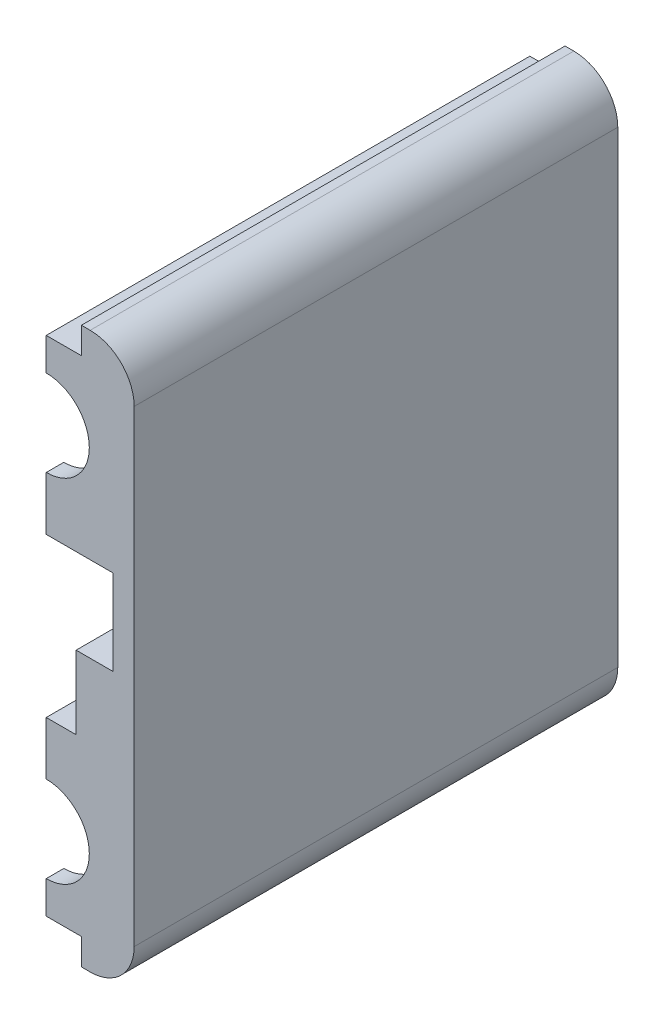
ISO-10303-21;
HEADER;
FILE_DESCRIPTION(('STEP AP214'),'2;1');
FILE_NAME('part.step','',(''),(''),'','','');
FILE_SCHEMA(('AUTOMOTIVE_DESIGN { 1 0 10303 214 1 1 1 1 }'));
ENDSEC;
DATA;
#1=APPLICATION_CONTEXT('core data for automotive mechanical design processes');
#2=APPLICATION_PROTOCOL_DEFINITION('international standard','automotive_design',2000,#1);
#3=PRODUCT_CONTEXT('',#1,'mechanical');
#4=PRODUCT('Part','Part','',(#3));
#5=PRODUCT_RELATED_PRODUCT_CATEGORY('part','',(#4));
#6=PRODUCT_DEFINITION_FORMATION('','',#4);
#7=PRODUCT_DEFINITION_CONTEXT('part definition',#1,'design');
#8=PRODUCT_DEFINITION('design','',#6,#7);
#9=PRODUCT_DEFINITION_SHAPE('','',#8);
#10=(LENGTH_UNIT() NAMED_UNIT(*) SI_UNIT(.MILLI.,.METRE.));
#11=(NAMED_UNIT(*) PLANE_ANGLE_UNIT() SI_UNIT($,.RADIAN.));
#12=(NAMED_UNIT(*) SI_UNIT($,.STERADIAN.) SOLID_ANGLE_UNIT());
#13=UNCERTAINTY_MEASURE_WITH_UNIT(LENGTH_MEASURE(1.E-05),#10,'distance_accuracy_value','');
#14=(GEOMETRIC_REPRESENTATION_CONTEXT(3) GLOBAL_UNCERTAINTY_ASSIGNED_CONTEXT((#13)) GLOBAL_UNIT_ASSIGNED_CONTEXT((#10,
#11,#12)) REPRESENTATION_CONTEXT('',''));
#15=CARTESIAN_POINT('',(0.,0.,0.));
#16=DIRECTION('',(0.,0.,1.));
#17=DIRECTION('',(1.,0.,0.));
#18=AXIS2_PLACEMENT_3D('',#15,#16,#17);
#19=CARTESIAN_POINT('',(-10.,-51.6,55.));
#20=DIRECTION('',(0.,0.,-1.));
#21=DIRECTION('',(-1.,0.,0.));
#22=AXIS2_PLACEMENT_3D('',#19,#20,#21);
#23=CYLINDRICAL_SURFACE('',#22,7.6);
#24=CARTESIAN_POINT('',(-10.,-51.6,53.));
#25=DIRECTION('',(0.,0.,-1.));
#26=DIRECTION('',(1.,0.,0.));
#27=AXIS2_PLACEMENT_3D('',#24,#25,#26);
#28=CIRCLE('',#27,7.6);
#29=CARTESIAN_POINT('',(-10.,-44.,53.));
#30=VERTEX_POINT('',#29);
#31=CARTESIAN_POINT('',(-10.,-59.2,53.));
#32=VERTEX_POINT('',#31);
#33=EDGE_CURVE('E547',#30,#32,#28,.T.);
#34=ORIENTED_EDGE('',*,*,#33,.F.);
#35=DIRECTION('',(0.,0.,-1.));
#36=VECTOR('',#35,1.);
#37=CARTESIAN_POINT('',(-10.,-44.,55.));
#38=LINE('',#37,#36);
#39=CARTESIAN_POINT('',(-10.,-44.,28.5));
#40=VERTEX_POINT('',#39);
#41=EDGE_CURVE('E352',#30,#40,#38,.T.);
#42=ORIENTED_EDGE('',*,*,#41,.T.);
#43=CARTESIAN_POINT('',(-10.,-51.6,28.5));
#44=DIRECTION('',(0.,0.,-1.));
#45=DIRECTION('',(-1.,0.,0.));
#46=AXIS2_PLACEMENT_3D('',#43,#44,#45);
#47=CIRCLE('',#46,7.6);
#48=CARTESIAN_POINT('',(-10.,-59.2,28.5));
#49=VERTEX_POINT('',#48);
#50=EDGE_CURVE('E468',#40,#49,#47,.T.);
#51=ORIENTED_EDGE('',*,*,#50,.T.);
#52=DIRECTION('',(0.,0.,-1.));
#53=VECTOR('',#52,1.);
#54=CARTESIAN_POINT('',(-10.,-59.2,55.));
#55=LINE('',#54,#53);
#56=EDGE_CURVE('E349',#32,#49,#55,.T.);
#57=ORIENTED_EDGE('',*,*,#56,.F.);
#58=EDGE_LOOP('',(#34,#42,#51,#57));
#59=FACE_BOUND('',#58,.T.);
#60=ADVANCED_FACE('F35',(#59),#23,.F.);
#61=CARTESIAN_POINT('',(-10.,-11.6,55.));
#62=DIRECTION('',(0.,0.,-1.));
#63=DIRECTION('',(-1.,0.,0.));
#64=AXIS2_PLACEMENT_3D('',#61,#62,#63);
#65=CYLINDRICAL_SURFACE('',#64,7.6);
#66=CARTESIAN_POINT('',(-10.,-11.6,53.));
#67=DIRECTION('',(0.,0.,-1.));
#68=DIRECTION('',(1.,0.,0.));
#69=AXIS2_PLACEMENT_3D('',#66,#67,#68);
#70=CIRCLE('',#69,7.6);
#71=CARTESIAN_POINT('',(-10.,-4.,53.));
#72=VERTEX_POINT('',#71);
#73=CARTESIAN_POINT('',(-10.,-19.2,53.));
#74=VERTEX_POINT('',#73);
#75=EDGE_CURVE('E562',#72,#74,#70,.T.);
#76=ORIENTED_EDGE('',*,*,#75,.F.);
#77=DIRECTION('',(0.,0.,-1.));
#78=VECTOR('',#77,1.);
#79=CARTESIAN_POINT('',(-10.,-4.,55.));
#80=LINE('',#79,#78);
#81=CARTESIAN_POINT('',(-10.,-4.,28.5));
#82=VERTEX_POINT('',#81);
#83=EDGE_CURVE('E367',#72,#82,#80,.T.);
#84=ORIENTED_EDGE('',*,*,#83,.T.);
#85=CARTESIAN_POINT('',(-10.,-11.6,28.5));
#86=DIRECTION('',(0.,0.,-1.));
#87=DIRECTION('',(-1.,0.,0.));
#88=AXIS2_PLACEMENT_3D('',#85,#86,#87);
#89=CIRCLE('',#88,7.6);
#90=CARTESIAN_POINT('',(-10.,-19.2,28.5));
#91=VERTEX_POINT('',#90);
#92=EDGE_CURVE('E492',#82,#91,#89,.T.);
#93=ORIENTED_EDGE('',*,*,#92,.T.);
#94=DIRECTION('',(0.,0.,-1.));
#95=VECTOR('',#94,1.);
#96=CARTESIAN_POINT('',(-10.,-19.2,55.));
#97=LINE('',#96,#95);
#98=EDGE_CURVE('E364',#74,#91,#97,.T.);
#99=ORIENTED_EDGE('',*,*,#98,.F.);
#100=EDGE_LOOP('',(#76,#84,#93,#99));
#101=FACE_BOUND('',#100,.T.);
#102=ADVANCED_FACE('F592',(#101),#65,.F.);
#103=CARTESIAN_POINT('',(-6.,0.,55.));
#104=DIRECTION('',(0.,-1.,0.));
#105=DIRECTION('',(0.,0.,-1.));
#106=AXIS2_PLACEMENT_3D('',#103,#104,#105);
#107=PLANE('',#106);
#108=DIRECTION('',(-1.,0.,0.));
#109=VECTOR('',#108,1.);
#110=CARTESIAN_POINT('',(-6.,0.,55.));
#111=LINE('',#110,#109);
#112=CARTESIAN_POINT('',(-5.,0.,55.));
#113=VERTEX_POINT('',#112);
#114=CARTESIAN_POINT('',(-6.,0.,55.));
#115=VERTEX_POINT('',#114);
#116=EDGE_CURVE('E339',#113,#115,#111,.T.);
#117=ORIENTED_EDGE('',*,*,#116,.F.);
#118=DIRECTION('',(0.,0.,-1.));
#119=VECTOR('',#118,1.);
#120=CARTESIAN_POINT('',(-5.,0.,55.));
#121=LINE('',#120,#119);
#122=CARTESIAN_POINT('',(-5.,0.,0.));
#123=VERTEX_POINT('',#122);
#124=EDGE_CURVE('E11',#113,#123,#121,.T.);
#125=ORIENTED_EDGE('',*,*,#124,.T.);
#126=DIRECTION('',(-1.,0.,0.));
#127=VECTOR('',#126,1.);
#128=CARTESIAN_POINT('',(-6.,0.,0.));
#129=LINE('',#128,#127);
#130=CARTESIAN_POINT('',(-6.,0.,0.));
#131=VERTEX_POINT('',#130);
#132=EDGE_CURVE('E307',#123,#131,#129,.T.);
#133=ORIENTED_EDGE('',*,*,#132,.T.);
#134=DIRECTION('',(0.,0.,-1.));
#135=VECTOR('',#134,1.);
#136=CARTESIAN_POINT('',(-6.,0.,55.));
#137=LINE('',#136,#135);
#138=EDGE_CURVE('E375',#115,#131,#137,.T.);
#139=ORIENTED_EDGE('',*,*,#138,.F.);
#140=EDGE_LOOP('',(#117,#125,#133,#139));
#141=FACE_BOUND('',#140,.T.);
#142=ADVANCED_FACE('F650',(#141),#107,.F.);
#143=CARTESIAN_POINT('',(-6.,-3.,55.));
#144=DIRECTION('',(1.,0.,0.));
#145=DIRECTION('',(0.,1.,0.));
#146=AXIS2_PLACEMENT_3D('',#143,#144,#145);
#147=PLANE('',#146);
#148=DIRECTION('',(0.,-1.,0.));
#149=VECTOR('',#148,1.);
#150=CARTESIAN_POINT('',(-6.,-3.,0.));
#151=LINE('',#150,#149);
#152=CARTESIAN_POINT('',(-6.,-3.,0.));
#153=VERTEX_POINT('',#152);
#154=EDGE_CURVE('E309',#131,#153,#151,.T.);
#155=ORIENTED_EDGE('',*,*,#154,.T.);
#156=DIRECTION('',(0.,0.,-1.));
#157=VECTOR('',#156,1.);
#158=CARTESIAN_POINT('',(-6.,-3.,55.));
#159=LINE('',#158,#157);
#160=CARTESIAN_POINT('',(-6.,-3.,55.));
#161=VERTEX_POINT('',#160);
#162=EDGE_CURVE('E372',#161,#153,#159,.T.);
#163=ORIENTED_EDGE('',*,*,#162,.F.);
#164=DIRECTION('',(0.,-1.,0.));
#165=VECTOR('',#164,1.);
#166=CARTESIAN_POINT('',(-6.,-3.,55.));
#167=LINE('',#166,#165);
#168=EDGE_CURVE('E516',#115,#161,#167,.T.);
#169=ORIENTED_EDGE('',*,*,#168,.F.);
#170=ORIENTED_EDGE('',*,*,#138,.T.);
#171=EDGE_LOOP('',(#155,#163,#169,#170));
#172=FACE_BOUND('',#171,.T.);
#173=ADVANCED_FACE('F862',(#172),#147,.F.);
#174=CARTESIAN_POINT('',(-10.,-3.,55.));
#175=DIRECTION('',(0.,-1.,0.));
#176=DIRECTION('',(0.,0.,-1.));
#177=AXIS2_PLACEMENT_3D('',#174,#175,#176);
#178=PLANE('',#177);
#179=DIRECTION('',(-1.,0.,0.));
#180=VECTOR('',#179,1.);
#181=CARTESIAN_POINT('',(-10.,-3.,0.));
#182=LINE('',#181,#180);
#183=CARTESIAN_POINT('',(-10.,-3.,0.));
#184=VERTEX_POINT('',#183);
#185=EDGE_CURVE('E312',#153,#184,#182,.T.);
#186=ORIENTED_EDGE('',*,*,#185,.T.);
#187=DIRECTION('',(0.,0.,-1.));
#188=VECTOR('',#187,1.);
#189=CARTESIAN_POINT('',(-10.,-3.,55.));
#190=LINE('',#189,#188);
#191=CARTESIAN_POINT('',(-10.,-3.,55.));
#192=VERTEX_POINT('',#191);
#193=EDGE_CURVE('E369',#192,#184,#190,.T.);
#194=ORIENTED_EDGE('',*,*,#193,.F.);
#195=DIRECTION('',(-1.,0.,0.));
#196=VECTOR('',#195,1.);
#197=CARTESIAN_POINT('',(-10.,-3.,55.));
#198=LINE('',#197,#196);
#199=EDGE_CURVE('E518',#161,#192,#198,.T.);
#200=ORIENTED_EDGE('',*,*,#199,.F.);
#201=ORIENTED_EDGE('',*,*,#162,.T.);
#202=EDGE_LOOP('',(#186,#194,#200,#201));
#203=FACE_BOUND('',#202,.T.);
#204=ADVANCED_FACE('F801',(#203),#178,.F.);
#205=CARTESIAN_POINT('',(-10.,-4.,55.));
#206=DIRECTION('',(1.,0.,0.));
#207=DIRECTION('',(0.,0.,-1.));
#208=AXIS2_PLACEMENT_3D('',#205,#206,#207);
#209=PLANE('',#208);
#210=DIRECTION('',(0.,-1.,0.));
#211=VECTOR('',#210,1.);
#212=CARTESIAN_POINT('',(-10.,-4.,0.));
#213=LINE('',#212,#211);
#214=CARTESIAN_POINT('',(-10.,-6.7,0.));
#215=VERTEX_POINT('',#214);
#216=EDGE_CURVE('E314',#184,#215,#213,.T.);
#217=ORIENTED_EDGE('',*,*,#216,.T.);
#218=DIRECTION('',(0.,0.,1.));
#219=VECTOR('',#218,1.);
#220=CARTESIAN_POINT('',(-10.,-6.7,0.));
#221=LINE('',#220,#219);
#222=CARTESIAN_POINT('',(-10.,-6.7,2.));
#223=VERTEX_POINT('',#222);
#224=EDGE_CURVE('E454',#215,#223,#221,.T.);
#225=ORIENTED_EDGE('',*,*,#224,.T.);
#226=DIRECTION('',(0.,1.,0.));
#227=VECTOR('',#226,1.);
#228=CARTESIAN_POINT('',(-10.,-4.,2.));
#229=LINE('',#228,#227);
#230=CARTESIAN_POINT('',(-10.,-4.,2.));
#231=VERTEX_POINT('',#230);
#232=EDGE_CURVE('E455',#223,#231,#229,.T.);
#233=ORIENTED_EDGE('',*,*,#232,.T.);
#234=CARTESIAN_POINT('',(-10.,-4.,26.5));
#235=VERTEX_POINT('',#234);
#236=EDGE_CURVE('E366',#235,#231,#80,.T.);
#237=ORIENTED_EDGE('',*,*,#236,.F.);
#238=DIRECTION('',(0.,1.,0.));
#239=VECTOR('',#238,1.);
#240=CARTESIAN_POINT('',(-10.,-6.7,26.5));
#241=LINE('',#240,#239);
#242=CARTESIAN_POINT('',(-10.,-6.7,26.5));
#243=VERTEX_POINT('',#242);
#244=EDGE_CURVE('E500',#243,#235,#241,.T.);
#245=ORIENTED_EDGE('',*,*,#244,.F.);
#246=DIRECTION('',(0.,0.,1.));
#247=VECTOR('',#246,1.);
#248=CARTESIAN_POINT('',(-10.,-6.7,26.5));
#249=LINE('',#248,#247);
#250=CARTESIAN_POINT('',(-10.,-6.7,28.5));
#251=VERTEX_POINT('',#250);
#252=EDGE_CURVE('E502',#243,#251,#249,.T.);
#253=ORIENTED_EDGE('',*,*,#252,.T.);
#254=DIRECTION('',(0.,1.,0.));
#255=VECTOR('',#254,1.);
#256=CARTESIAN_POINT('',(-10.,-6.7,28.5));
#257=LINE('',#256,#255);
#258=EDGE_CURVE('E496',#251,#82,#257,.T.);
#259=ORIENTED_EDGE('',*,*,#258,.T.);
#260=ORIENTED_EDGE('',*,*,#83,.F.);
#261=DIRECTION('',(0.,1.,0.));
#262=VECTOR('',#261,1.);
#263=CARTESIAN_POINT('',(-10.,-4.,53.));
#264=LINE('',#263,#262);
#265=CARTESIAN_POINT('',(-10.,-6.7,53.));
#266=VERTEX_POINT('',#265);
#267=EDGE_CURVE('E567',#266,#72,#264,.T.);
#268=ORIENTED_EDGE('',*,*,#267,.F.);
#269=DIRECTION('',(0.,0.,-1.));
#270=VECTOR('',#269,1.);
#271=CARTESIAN_POINT('',(-10.,-6.7,55.));
#272=LINE('',#271,#270);
#273=CARTESIAN_POINT('',(-10.,-6.7,55.));
#274=VERTEX_POINT('',#273);
#275=EDGE_CURVE('E448',#274,#266,#272,.T.);
#276=ORIENTED_EDGE('',*,*,#275,.F.);
#277=DIRECTION('',(0.,-1.,0.));
#278=VECTOR('',#277,1.);
#279=CARTESIAN_POINT('',(-10.,-4.,55.));
#280=LINE('',#279,#278);
#281=EDGE_CURVE('E520',#192,#274,#280,.T.);
#282=ORIENTED_EDGE('',*,*,#281,.F.);
#283=ORIENTED_EDGE('',*,*,#193,.T.);
#284=EDGE_LOOP('',(#217,#225,#233,#237,#245,#253,#259,#260,#268,#276,#282,#283));
#285=FACE_BOUND('',#284,.T.);
#286=ADVANCED_FACE('F606',(#285),#209,.F.);
#287=ORIENTED_EDGE('',*,*,#236,.T.);
#288=CARTESIAN_POINT('',(-10.,-11.6,2.));
#289=DIRECTION('',(0.,0.,-1.));
#290=DIRECTION('',(1.,0.,0.));
#291=AXIS2_PLACEMENT_3D('',#288,#289,#290);
#292=CIRCLE('',#291,7.6);
#293=CARTESIAN_POINT('',(-10.,-19.2,2.));
#294=VERTEX_POINT('',#293);
#295=EDGE_CURVE('E429',#231,#294,#292,.T.);
#296=ORIENTED_EDGE('',*,*,#295,.T.);
#297=CARTESIAN_POINT('',(-10.,-19.2,26.5));
#298=VERTEX_POINT('',#297);
#299=EDGE_CURVE('E363',#298,#294,#97,.T.);
#300=ORIENTED_EDGE('',*,*,#299,.F.);
#301=CARTESIAN_POINT('',(-10.,-11.6,26.5));
#302=DIRECTION('',(0.,0.,-1.));
#303=DIRECTION('',(-1.,0.,0.));
#304=AXIS2_PLACEMENT_3D('',#301,#302,#303);
#305=CIRCLE('',#304,7.6);
#306=EDGE_CURVE('E493',#235,#298,#305,.T.);
#307=ORIENTED_EDGE('',*,*,#306,.F.);
#308=EDGE_LOOP('',(#287,#296,#300,#307));
#309=FACE_BOUND('',#308,.T.);
#310=ADVANCED_FACE('F614',(#309),#65,.F.);
#311=CARTESIAN_POINT('',(-10.,-22.6,55.));
#312=DIRECTION('',(1.,0.,0.));
#313=DIRECTION('',(0.,0.,-1.));
#314=AXIS2_PLACEMENT_3D('',#311,#312,#313);
#315=PLANE('',#314);
#316=DIRECTION('',(0.,-1.,0.));
#317=VECTOR('',#316,1.);
#318=CARTESIAN_POINT('',(-10.,-22.6,0.));
#319=LINE('',#318,#317);
#320=CARTESIAN_POINT('',(-10.,-16.5,0.));
#321=VERTEX_POINT('',#320);
#322=CARTESIAN_POINT('',(-10.,-22.6,0.));
#323=VERTEX_POINT('',#322);
#324=EDGE_CURVE('E316',#321,#323,#319,.T.);
#325=ORIENTED_EDGE('',*,*,#324,.T.);
#326=DIRECTION('',(0.,0.,-1.));
#327=VECTOR('',#326,1.);
#328=CARTESIAN_POINT('',(-10.,-22.6,55.));
#329=LINE('',#328,#327);
#330=CARTESIAN_POINT('',(-10.,-22.6,55.));
#331=VERTEX_POINT('',#330);
#332=EDGE_CURVE('E360',#331,#323,#329,.T.);
#333=ORIENTED_EDGE('',*,*,#332,.F.);
#334=DIRECTION('',(0.,-1.,0.));
#335=VECTOR('',#334,1.);
#336=CARTESIAN_POINT('',(-10.,-22.6,55.));
#337=LINE('',#336,#335);
#338=CARTESIAN_POINT('',(-10.,-16.5,55.));
#339=VERTEX_POINT('',#338);
#340=EDGE_CURVE('E522',#339,#331,#337,.T.);
#341=ORIENTED_EDGE('',*,*,#340,.F.);
#342=DIRECTION('',(0.,0.,-1.));
#343=VECTOR('',#342,1.);
#344=CARTESIAN_POINT('',(-10.,-16.5,55.));
#345=LINE('',#344,#343);
#346=CARTESIAN_POINT('',(-10.,-16.5,53.));
#347=VERTEX_POINT('',#346);
#348=EDGE_CURVE('E444',#339,#347,#345,.T.);
#349=ORIENTED_EDGE('',*,*,#348,.T.);
#350=DIRECTION('',(0.,1.,0.));
#351=VECTOR('',#350,1.);
#352=CARTESIAN_POINT('',(-10.,-16.5,53.));
#353=LINE('',#352,#351);
#354=EDGE_CURVE('E570',#74,#347,#353,.T.);
#355=ORIENTED_EDGE('',*,*,#354,.F.);
#356=ORIENTED_EDGE('',*,*,#98,.T.);
#357=DIRECTION('',(0.,1.,0.));
#358=VECTOR('',#357,1.);
#359=CARTESIAN_POINT('',(-10.,-19.2,28.5));
#360=LINE('',#359,#358);
#361=CARTESIAN_POINT('',(-10.,-16.5,28.5));
#362=VERTEX_POINT('',#361);
#363=EDGE_CURVE('E505',#91,#362,#360,.T.);
#364=ORIENTED_EDGE('',*,*,#363,.T.);
#365=DIRECTION('',(0.,0.,1.));
#366=VECTOR('',#365,1.);
#367=CARTESIAN_POINT('',(-10.,-16.5,26.5));
#368=LINE('',#367,#366);
#369=CARTESIAN_POINT('',(-10.,-16.5,26.5));
#370=VERTEX_POINT('',#369);
#371=EDGE_CURVE('E310',#370,#362,#368,.T.);
#372=ORIENTED_EDGE('',*,*,#371,.F.);
#373=DIRECTION('',(0.,1.,0.));
#374=VECTOR('',#373,1.);
#375=CARTESIAN_POINT('',(-10.,-19.2,26.5));
#376=LINE('',#375,#374);
#377=EDGE_CURVE('E495',#298,#370,#376,.T.);
#378=ORIENTED_EDGE('',*,*,#377,.F.);
#379=ORIENTED_EDGE('',*,*,#299,.T.);
#380=DIRECTION('',(0.,1.,0.));
#381=VECTOR('',#380,1.);
#382=CARTESIAN_POINT('',(-10.,-16.5,2.));
#383=LINE('',#382,#381);
#384=CARTESIAN_POINT('',(-10.,-16.5,2.));
#385=VERTEX_POINT('',#384);
#386=EDGE_CURVE('E457',#294,#385,#383,.T.);
#387=ORIENTED_EDGE('',*,*,#386,.T.);
#388=DIRECTION('',(0.,0.,1.));
#389=VECTOR('',#388,1.);
#390=CARTESIAN_POINT('',(-10.,-16.5,0.));
#391=LINE('',#390,#389);
#392=EDGE_CURVE('E465',#321,#385,#391,.T.);
#393=ORIENTED_EDGE('',*,*,#392,.F.);
#394=EDGE_LOOP('',(#325,#333,#341,#349,#355,#356,#364,#372,#378,#379,#387,#393));
#395=FACE_BOUND('',#394,.T.);
#396=ADVANCED_FACE('F581',(#395),#315,.F.);
#397=CARTESIAN_POINT('',(-2.4,-22.6,55.));
#398=DIRECTION('',(0.,1.,0.));
#399=DIRECTION('',(0.,0.,1.));
#400=AXIS2_PLACEMENT_3D('',#397,#398,#399);
#401=PLANE('',#400);
#402=DIRECTION('',(1.,0.,0.));
#403=VECTOR('',#402,1.);
#404=CARTESIAN_POINT('',(-2.4,-22.6,0.));
#405=LINE('',#404,#403);
#406=CARTESIAN_POINT('',(-2.4,-22.6,0.));
#407=VERTEX_POINT('',#406);
#408=EDGE_CURVE('E318',#323,#407,#405,.T.);
#409=ORIENTED_EDGE('',*,*,#408,.T.);
#410=DIRECTION('',(0.,0.,-1.));
#411=VECTOR('',#410,1.);
#412=CARTESIAN_POINT('',(-2.4,-22.6,55.));
#413=LINE('',#412,#411);
#414=CARTESIAN_POINT('',(-2.4,-22.6,55.));
#415=VERTEX_POINT('',#414);
#416=EDGE_CURVE('E357',#415,#407,#413,.T.);
#417=ORIENTED_EDGE('',*,*,#416,.F.);
#418=DIRECTION('',(1.,0.,0.));
#419=VECTOR('',#418,1.);
#420=CARTESIAN_POINT('',(-2.4,-22.6,55.));
#421=LINE('',#420,#419);
#422=EDGE_CURVE('E524',#331,#415,#421,.T.);
#423=ORIENTED_EDGE('',*,*,#422,.F.);
#424=ORIENTED_EDGE('',*,*,#332,.T.);
#425=EDGE_LOOP('',(#409,#417,#423,#424));
#426=FACE_BOUND('',#425,.T.);
#427=ADVANCED_FACE('F633',(#426),#401,.F.);
#428=CARTESIAN_POINT('',(-2.4,-32.3,55.));
#429=DIRECTION('',(1.,0.,0.));
#430=DIRECTION('',(0.,1.,0.));
#431=AXIS2_PLACEMENT_3D('',#428,#429,#430);
#432=PLANE('',#431);
#433=DIRECTION('',(0.,-1.,0.));
#434=VECTOR('',#433,1.);
#435=CARTESIAN_POINT('',(-2.4,-32.3,0.));
#436=LINE('',#435,#434);
#437=CARTESIAN_POINT('',(-2.4,-32.3,0.));
#438=VERTEX_POINT('',#437);
#439=EDGE_CURVE('E320',#407,#438,#436,.T.);
#440=ORIENTED_EDGE('',*,*,#439,.T.);
#441=DIRECTION('',(0.,0.,-1.));
#442=VECTOR('',#441,1.);
#443=CARTESIAN_POINT('',(-2.4,-32.3,55.));
#444=LINE('',#443,#442);
#445=CARTESIAN_POINT('',(-2.4,-32.3,55.));
#446=VERTEX_POINT('',#445);
#447=EDGE_CURVE('E354',#446,#438,#444,.T.);
#448=ORIENTED_EDGE('',*,*,#447,.F.);
#449=DIRECTION('',(0.,-1.,0.));
#450=VECTOR('',#449,1.);
#451=CARTESIAN_POINT('',(-2.4,-32.3,55.));
#452=LINE('',#451,#450);
#453=EDGE_CURVE('E294',#415,#446,#452,.T.);
#454=ORIENTED_EDGE('',*,*,#453,.F.);
#455=ORIENTED_EDGE('',*,*,#416,.T.);
#456=EDGE_LOOP('',(#440,#448,#454,#455));
#457=FACE_BOUND('',#456,.T.);
#458=ADVANCED_FACE('F531',(#457),#432,.F.);
#459=CARTESIAN_POINT('',(-10.,-32.3,55.));
#460=DIRECTION('',(0.,-1.,0.));
#461=DIRECTION('',(0.,0.,-1.));
#462=AXIS2_PLACEMENT_3D('',#459,#460,#461);
#463=PLANE('',#462);
#464=DIRECTION('',(-1.,0.,0.));
#465=VECTOR('',#464,1.);
#466=CARTESIAN_POINT('',(-10.,-32.3,0.));
#467=LINE('',#466,#465);
#468=CARTESIAN_POINT('',(-6.6,-32.3,0.));
#469=VERTEX_POINT('',#468);
#470=EDGE_CURVE('E322',#438,#469,#467,.T.);
#471=ORIENTED_EDGE('',*,*,#470,.T.);
#472=DIRECTION('',(0.,0.,1.));
#473=VECTOR('',#472,1.);
#474=CARTESIAN_POINT('',(-6.6,-32.3,-8.99716066323149));
#475=LINE('',#474,#473);
#476=CARTESIAN_POINT('',(-6.6,-32.3,55.));
#477=VERTEX_POINT('',#476);
#478=EDGE_CURVE('E537',#469,#477,#475,.T.);
#479=ORIENTED_EDGE('',*,*,#478,.T.);
#480=DIRECTION('',(-1.,0.,0.));
#481=VECTOR('',#480,1.);
#482=CARTESIAN_POINT('',(-10.,-32.3,55.));
#483=LINE('',#482,#481);
#484=EDGE_CURVE('E290',#446,#477,#483,.T.);
#485=ORIENTED_EDGE('',*,*,#484,.F.);
#486=ORIENTED_EDGE('',*,*,#447,.T.);
#487=EDGE_LOOP('',(#471,#479,#485,#486));
#488=FACE_BOUND('',#487,.T.);
#489=ADVANCED_FACE('F536',(#488),#463,.F.);
#490=CARTESIAN_POINT('',(-10.,-44.,55.));
#491=DIRECTION('',(1.,0.,0.));
#492=DIRECTION('',(0.,0.,-1.));
#493=AXIS2_PLACEMENT_3D('',#490,#491,#492);
#494=PLANE('',#493);
#495=DIRECTION('',(0.,-1.,0.));
#496=VECTOR('',#495,1.);
#497=CARTESIAN_POINT('',(-10.,-44.,55.));
#498=LINE('',#497,#496);
#499=CARTESIAN_POINT('',(-10.,-40.63,55.));
#500=VERTEX_POINT('',#499);
#501=CARTESIAN_POINT('',(-10.,-46.7,55.));
#502=VERTEX_POINT('',#501);
#503=EDGE_CURVE('E281',#500,#502,#498,.T.);
#504=ORIENTED_EDGE('',*,*,#503,.F.);
#505=DIRECTION('',(0.,0.,1.));
#506=VECTOR('',#505,1.);
#507=CARTESIAN_POINT('',(-10.,-40.63,-8.99716066323149));
#508=LINE('',#507,#506);
#509=CARTESIAN_POINT('',(-10.,-40.63,0.));
#510=VERTEX_POINT('',#509);
#511=EDGE_CURVE('E267',#510,#500,#508,.T.);
#512=ORIENTED_EDGE('',*,*,#511,.F.);
#513=DIRECTION('',(0.,-1.,0.));
#514=VECTOR('',#513,1.);
#515=CARTESIAN_POINT('',(-10.,-44.,0.));
#516=LINE('',#515,#514);
#517=CARTESIAN_POINT('',(-10.,-46.7,0.));
#518=VERTEX_POINT('',#517);
#519=EDGE_CURVE('E325',#510,#518,#516,.T.);
#520=ORIENTED_EDGE('',*,*,#519,.T.);
#521=DIRECTION('',(0.,0.,1.));
#522=VECTOR('',#521,1.);
#523=CARTESIAN_POINT('',(-10.,-46.7,0.));
#524=LINE('',#523,#522);
#525=CARTESIAN_POINT('',(-10.,-46.7,2.));
#526=VERTEX_POINT('',#525);
#527=EDGE_CURVE('E430',#518,#526,#524,.T.);
#528=ORIENTED_EDGE('',*,*,#527,.T.);
#529=DIRECTION('',(0.,1.,0.));
#530=VECTOR('',#529,1.);
#531=CARTESIAN_POINT('',(-10.,-44.,2.));
#532=LINE('',#531,#530);
#533=CARTESIAN_POINT('',(-10.,-44.,2.));
#534=VERTEX_POINT('',#533);
#535=EDGE_CURVE('E436',#526,#534,#532,.T.);
#536=ORIENTED_EDGE('',*,*,#535,.T.);
#537=CARTESIAN_POINT('',(-10.,-44.,26.5));
#538=VERTEX_POINT('',#537);
#539=EDGE_CURVE('E351',#538,#534,#38,.T.);
#540=ORIENTED_EDGE('',*,*,#539,.F.);
#541=DIRECTION('',(0.,1.,0.));
#542=VECTOR('',#541,1.);
#543=CARTESIAN_POINT('',(-10.,-46.7,26.5));
#544=LINE('',#543,#542);
#545=CARTESIAN_POINT('',(-10.,-46.7,26.5));
#546=VERTEX_POINT('',#545);
#547=EDGE_CURVE('E476',#546,#538,#544,.T.);
#548=ORIENTED_EDGE('',*,*,#547,.F.);
#549=DIRECTION('',(0.,0.,1.));
#550=VECTOR('',#549,1.);
#551=CARTESIAN_POINT('',(-10.,-46.7,26.5));
#552=LINE('',#551,#550);
#553=CARTESIAN_POINT('',(-10.,-46.7,28.5));
#554=VERTEX_POINT('',#553);
#555=EDGE_CURVE('E478',#546,#554,#552,.T.);
#556=ORIENTED_EDGE('',*,*,#555,.T.);
#557=DIRECTION('',(0.,1.,0.));
#558=VECTOR('',#557,1.);
#559=CARTESIAN_POINT('',(-10.,-46.7,28.5));
#560=LINE('',#559,#558);
#561=EDGE_CURVE('E472',#554,#40,#560,.T.);
#562=ORIENTED_EDGE('',*,*,#561,.T.);
#563=ORIENTED_EDGE('',*,*,#41,.F.);
#564=DIRECTION('',(0.,1.,0.));
#565=VECTOR('',#564,1.);
#566=CARTESIAN_POINT('',(-10.,-44.,53.));
#567=LINE('',#566,#565);
#568=CARTESIAN_POINT('',(-10.,-46.7,53.));
#569=VERTEX_POINT('',#568);
#570=EDGE_CURVE('E551',#569,#30,#567,.T.);
#571=ORIENTED_EDGE('',*,*,#570,.F.);
#572=DIRECTION('',(0.,0.,-1.));
#573=VECTOR('',#572,1.);
#574=CARTESIAN_POINT('',(-10.,-46.7,55.));
#575=LINE('',#574,#573);
#576=EDGE_CURVE('E287',#502,#569,#575,.T.);
#577=ORIENTED_EDGE('',*,*,#576,.F.);
#578=EDGE_LOOP('',(#504,#512,#520,#528,#536,#540,#548,#556,#562,#563,#571,#577));
#579=FACE_BOUND('',#578,.T.);
#580=ADVANCED_FACE('F285',(#579),#494,.F.);
#581=ORIENTED_EDGE('',*,*,#539,.T.);
#582=CARTESIAN_POINT('',(-10.,-51.6,2.));
#583=DIRECTION('',(0.,0.,-1.));
#584=DIRECTION('',(1.,0.,0.));
#585=AXIS2_PLACEMENT_3D('',#582,#583,#584);
#586=CIRCLE('',#585,7.6);
#587=CARTESIAN_POINT('',(-10.,-59.2,2.));
#588=VERTEX_POINT('',#587);
#589=EDGE_CURVE('E446',#534,#588,#586,.T.);
#590=ORIENTED_EDGE('',*,*,#589,.T.);
#591=CARTESIAN_POINT('',(-10.,-59.2,26.5));
#592=VERTEX_POINT('',#591);
#593=EDGE_CURVE('E348',#592,#588,#55,.T.);
#594=ORIENTED_EDGE('',*,*,#593,.F.);
#595=CARTESIAN_POINT('',(-10.,-51.6,26.5));
#596=DIRECTION('',(0.,0.,-1.));
#597=DIRECTION('',(-1.,0.,0.));
#598=AXIS2_PLACEMENT_3D('',#595,#596,#597);
#599=CIRCLE('',#598,7.6);
#600=EDGE_CURVE('E469',#538,#592,#599,.T.);
#601=ORIENTED_EDGE('',*,*,#600,.F.);
#602=EDGE_LOOP('',(#581,#590,#594,#601));
#603=FACE_BOUND('',#602,.T.);
#604=ADVANCED_FACE('F646',(#603),#23,.F.);
#605=CARTESIAN_POINT('',(-10.,-60.2,55.));
#606=DIRECTION('',(1.,0.,0.));
#607=DIRECTION('',(0.,0.,-1.));
#608=AXIS2_PLACEMENT_3D('',#605,#606,#607);
#609=PLANE('',#608);
#610=DIRECTION('',(0.,-1.,0.));
#611=VECTOR('',#610,1.);
#612=CARTESIAN_POINT('',(-10.,-60.2,0.));
#613=LINE('',#612,#611);
#614=CARTESIAN_POINT('',(-10.,-56.5,0.));
#615=VERTEX_POINT('',#614);
#616=CARTESIAN_POINT('',(-10.,-60.2,0.));
#617=VERTEX_POINT('',#616);
#618=EDGE_CURVE('E327',#615,#617,#613,.T.);
#619=ORIENTED_EDGE('',*,*,#618,.T.);
#620=DIRECTION('',(0.,0.,-1.));
#621=VECTOR('',#620,1.);
#622=CARTESIAN_POINT('',(-10.,-60.2,55.));
#623=LINE('',#622,#621);
#624=CARTESIAN_POINT('',(-10.,-60.2,55.));
#625=VERTEX_POINT('',#624);
#626=EDGE_CURVE('E345',#625,#617,#623,.T.);
#627=ORIENTED_EDGE('',*,*,#626,.F.);
#628=DIRECTION('',(0.,-1.,0.));
#629=VECTOR('',#628,1.);
#630=CARTESIAN_POINT('',(-10.,-60.2,55.));
#631=LINE('',#630,#629);
#632=CARTESIAN_POINT('',(-10.,-56.5,55.));
#633=VERTEX_POINT('',#632);
#634=EDGE_CURVE('E289',#633,#625,#631,.T.);
#635=ORIENTED_EDGE('',*,*,#634,.F.);
#636=DIRECTION('',(0.,0.,-1.));
#637=VECTOR('',#636,1.);
#638=CARTESIAN_POINT('',(-10.,-56.5,55.));
#639=LINE('',#638,#637);
#640=CARTESIAN_POINT('',(-10.,-56.5,53.));
#641=VERTEX_POINT('',#640);
#642=EDGE_CURVE('E550',#633,#641,#639,.T.);
#643=ORIENTED_EDGE('',*,*,#642,.T.);
#644=DIRECTION('',(0.,1.,0.));
#645=VECTOR('',#644,1.);
#646=CARTESIAN_POINT('',(-10.,-56.5,53.));
#647=LINE('',#646,#645);
#648=EDGE_CURVE('E554',#32,#641,#647,.T.);
#649=ORIENTED_EDGE('',*,*,#648,.F.);
#650=ORIENTED_EDGE('',*,*,#56,.T.);
#651=DIRECTION('',(0.,1.,0.));
#652=VECTOR('',#651,1.);
#653=CARTESIAN_POINT('',(-10.,-59.2,28.5));
#654=LINE('',#653,#652);
#655=CARTESIAN_POINT('',(-10.,-56.5,28.5));
#656=VERTEX_POINT('',#655);
#657=EDGE_CURVE('E481',#49,#656,#654,.T.);
#658=ORIENTED_EDGE('',*,*,#657,.T.);
#659=DIRECTION('',(0.,0.,1.));
#660=VECTOR('',#659,1.);
#661=CARTESIAN_POINT('',(-10.,-56.5,26.5));
#662=LINE('',#661,#660);
#663=CARTESIAN_POINT('',(-10.,-56.5,26.5));
#664=VERTEX_POINT('',#663);
#665=EDGE_CURVE('E489',#664,#656,#662,.T.);
#666=ORIENTED_EDGE('',*,*,#665,.F.);
#667=DIRECTION('',(0.,1.,0.));
#668=VECTOR('',#667,1.);
#669=CARTESIAN_POINT('',(-10.,-59.2,26.5));
#670=LINE('',#669,#668);
#671=EDGE_CURVE('E471',#592,#664,#670,.T.);
#672=ORIENTED_EDGE('',*,*,#671,.F.);
#673=ORIENTED_EDGE('',*,*,#593,.T.);
#674=DIRECTION('',(0.,1.,0.));
#675=VECTOR('',#674,1.);
#676=CARTESIAN_POINT('',(-10.,-56.5,2.));
#677=LINE('',#676,#675);
#678=CARTESIAN_POINT('',(-10.,-56.5,2.));
#679=VERTEX_POINT('',#678);
#680=EDGE_CURVE('E426',#588,#679,#677,.T.);
#681=ORIENTED_EDGE('',*,*,#680,.T.);
#682=DIRECTION('',(0.,0.,1.));
#683=VECTOR('',#682,1.);
#684=CARTESIAN_POINT('',(-10.,-56.5,0.));
#685=LINE('',#684,#683);
#686=EDGE_CURVE('E422',#615,#679,#685,.T.);
#687=ORIENTED_EDGE('',*,*,#686,.F.);
#688=EDGE_LOOP('',(#619,#627,#635,#643,#649,#650,#658,#666,#672,#673,#681,#687));
#689=FACE_BOUND('',#688,.T.);
#690=ADVANCED_FACE('F419',(#689),#609,.F.);
#691=CARTESIAN_POINT('',(-6.,-60.2,55.));
#692=DIRECTION('',(0.,1.,0.));
#693=DIRECTION('',(0.,0.,1.));
#694=AXIS2_PLACEMENT_3D('',#691,#692,#693);
#695=PLANE('',#694);
#696=DIRECTION('',(1.,0.,0.));
#697=VECTOR('',#696,1.);
#698=CARTESIAN_POINT('',(-6.,-60.2,0.));
#699=LINE('',#698,#697);
#700=CARTESIAN_POINT('',(-6.,-60.2,0.));
#701=VERTEX_POINT('',#700);
#702=EDGE_CURVE('E329',#617,#701,#699,.T.);
#703=ORIENTED_EDGE('',*,*,#702,.T.);
#704=DIRECTION('',(0.,0.,-1.));
#705=VECTOR('',#704,1.);
#706=CARTESIAN_POINT('',(-6.,-60.2,55.));
#707=LINE('',#706,#705);
#708=CARTESIAN_POINT('',(-6.,-60.2,55.));
#709=VERTEX_POINT('',#708);
#710=EDGE_CURVE('E342',#709,#701,#707,.T.);
#711=ORIENTED_EDGE('',*,*,#710,.F.);
#712=DIRECTION('',(1.,0.,0.));
#713=VECTOR('',#712,1.);
#714=CARTESIAN_POINT('',(-6.,-60.2,55.));
#715=LINE('',#714,#713);
#716=EDGE_CURVE('E292',#625,#709,#715,.T.);
#717=ORIENTED_EDGE('',*,*,#716,.F.);
#718=ORIENTED_EDGE('',*,*,#626,.T.);
#719=EDGE_LOOP('',(#703,#711,#717,#718));
#720=FACE_BOUND('',#719,.T.);
#721=ADVANCED_FACE('F415',(#720),#695,.F.);
#722=CARTESIAN_POINT('',(-6.,-63.2,55.));
#723=DIRECTION('',(1.,0.,0.));
#724=DIRECTION('',(0.,0.,-1.));
#725=AXIS2_PLACEMENT_3D('',#722,#723,#724);
#726=PLANE('',#725);
#727=DIRECTION('',(0.,-1.,0.));
#728=VECTOR('',#727,1.);
#729=CARTESIAN_POINT('',(-6.,-63.2,0.));
#730=LINE('',#729,#728);
#731=CARTESIAN_POINT('',(-6.,-63.2,0.));
#732=VERTEX_POINT('',#731);
#733=EDGE_CURVE('E331',#701,#732,#730,.T.);
#734=ORIENTED_EDGE('',*,*,#733,.T.);
#735=DIRECTION('',(0.,0.,-1.));
#736=VECTOR('',#735,1.);
#737=CARTESIAN_POINT('',(-6.,-63.2,55.));
#738=LINE('',#737,#736);
#739=CARTESIAN_POINT('',(-6.,-63.2,55.));
#740=VERTEX_POINT('',#739);
#741=EDGE_CURVE('E306',#740,#732,#738,.T.);
#742=ORIENTED_EDGE('',*,*,#741,.F.);
#743=DIRECTION('',(0.,-1.,0.));
#744=VECTOR('',#743,1.);
#745=CARTESIAN_POINT('',(-6.,-63.2,55.));
#746=LINE('',#745,#744);
#747=EDGE_CURVE('E299',#709,#740,#746,.T.);
#748=ORIENTED_EDGE('',*,*,#747,.F.);
#749=ORIENTED_EDGE('',*,*,#710,.T.);
#750=EDGE_LOOP('',(#734,#742,#748,#749));
#751=FACE_BOUND('',#750,.T.);
#752=ADVANCED_FACE('F409',(#751),#726,.F.);
#753=CARTESIAN_POINT('',(0.,-63.2,55.));
#754=DIRECTION('',(0.,1.,0.));
#755=DIRECTION('',(0.,0.,1.));
#756=AXIS2_PLACEMENT_3D('',#753,#754,#755);
#757=PLANE('',#756);
#758=DIRECTION('',(1.,0.,0.));
#759=VECTOR('',#758,1.);
#760=CARTESIAN_POINT('',(0.,-63.2,0.));
#761=LINE('',#760,#759);
#762=CARTESIAN_POINT('',(-4.99999999999999,-63.2,0.));
#763=VERTEX_POINT('',#762);
#764=EDGE_CURVE('E333',#732,#763,#761,.T.);
#765=ORIENTED_EDGE('',*,*,#764,.T.);
#766=DIRECTION('',(0.,0.,-1.));
#767=VECTOR('',#766,1.);
#768=CARTESIAN_POINT('',(-4.99999999999999,-63.2,55.));
#769=LINE('',#768,#767);
#770=CARTESIAN_POINT('',(-4.99999999999999,-63.2,55.));
#771=VERTEX_POINT('',#770);
#772=EDGE_CURVE('E387',#763,#771,#769,.F.);
#773=ORIENTED_EDGE('',*,*,#772,.T.);
#774=DIRECTION('',(1.,0.,0.));
#775=VECTOR('',#774,1.);
#776=CARTESIAN_POINT('',(0.,-63.2,55.));
#777=LINE('',#776,#775);
#778=EDGE_CURVE('E301',#740,#771,#777,.T.);
#779=ORIENTED_EDGE('',*,*,#778,.F.);
#780=ORIENTED_EDGE('',*,*,#741,.T.);
#781=EDGE_LOOP('',(#765,#773,#779,#780));
#782=FACE_BOUND('',#781,.T.);
#783=ADVANCED_FACE('F405',(#782),#757,.F.);
#784=CARTESIAN_POINT('',(0.,0.,55.));
#785=DIRECTION('',(-1.,0.,0.));
#786=DIRECTION('',(0.,-1.,0.));
#787=AXIS2_PLACEMENT_3D('',#784,#785,#786);
#788=PLANE('',#787);
#789=DIRECTION('',(0.,1.,0.));
#790=VECTOR('',#789,1.);
#791=CARTESIAN_POINT('',(0.,0.,55.));
#792=LINE('',#791,#790);
#793=CARTESIAN_POINT('',(0.,-58.2,55.));
#794=VERTEX_POINT('',#793);
#795=CARTESIAN_POINT('',(0.,-5.,55.));
#796=VERTEX_POINT('',#795);
#797=EDGE_CURVE('E304',#794,#796,#792,.T.);
#798=ORIENTED_EDGE('',*,*,#797,.F.);
#799=DIRECTION('',(0.,0.,-1.));
#800=VECTOR('',#799,1.);
#801=CARTESIAN_POINT('',(0.,-58.2,55.));
#802=LINE('',#801,#800);
#803=CARTESIAN_POINT('',(0.,-58.2,0.));
#804=VERTEX_POINT('',#803);
#805=EDGE_CURVE('E380',#794,#804,#802,.T.);
#806=ORIENTED_EDGE('',*,*,#805,.T.);
#807=DIRECTION('',(0.,1.,0.));
#808=VECTOR('',#807,1.);
#809=CARTESIAN_POINT('',(0.,0.,0.));
#810=LINE('',#809,#808);
#811=CARTESIAN_POINT('',(0.,-5.,0.));
#812=VERTEX_POINT('',#811);
#813=EDGE_CURVE('E336',#804,#812,#810,.T.);
#814=ORIENTED_EDGE('',*,*,#813,.T.);
#815=DIRECTION('',(0.,0.,-1.));
#816=VECTOR('',#815,1.);
#817=CARTESIAN_POINT('',(0.,-5.,55.));
#818=LINE('',#817,#816);
#819=EDGE_CURVE('E378',#812,#796,#818,.F.);
#820=ORIENTED_EDGE('',*,*,#819,.T.);
#821=EDGE_LOOP('',(#798,#806,#814,#820));
#822=FACE_BOUND('',#821,.T.);
#823=ADVANCED_FACE('F396',(#822),#788,.F.);
#824=CARTESIAN_POINT('',(-10.,-51.6,55.));
#825=DIRECTION('',(0.,0.,1.));
#826=DIRECTION('',(1.,0.,0.));
#827=AXIS2_PLACEMENT_3D('',#824,#825,#826);
#828=PLANE('',#827);
#829=DIRECTION('',(0.,1.,0.));
#830=VECTOR('',#829,1.);
#831=CARTESIAN_POINT('',(-6.6,-32.3,55.));
#832=LINE('',#831,#830);
#833=CARTESIAN_POINT('',(-6.6,-40.63,55.));
#834=VERTEX_POINT('',#833);
#835=EDGE_CURVE('E277',#834,#477,#832,.T.);
#836=ORIENTED_EDGE('',*,*,#835,.F.);
#837=DIRECTION('',(1.,0.,0.));
#838=VECTOR('',#837,1.);
#839=CARTESIAN_POINT('',(-10.,-40.63,55.));
#840=LINE('',#839,#838);
#841=EDGE_CURVE('E270',#500,#834,#840,.T.);
#842=ORIENTED_EDGE('',*,*,#841,.F.);
#843=ORIENTED_EDGE('',*,*,#503,.T.);
#844=CARTESIAN_POINT('',(-10.,-51.6,55.));
#845=DIRECTION('',(0.,0.,1.));
#846=DIRECTION('',(-1.,0.,0.));
#847=AXIS2_PLACEMENT_3D('',#844,#845,#846);
#848=CIRCLE('',#847,4.9);
#849=EDGE_CURVE('E548',#633,#502,#848,.T.);
#850=ORIENTED_EDGE('',*,*,#849,.F.);
#851=ORIENTED_EDGE('',*,*,#634,.T.);
#852=ORIENTED_EDGE('',*,*,#716,.T.);
#853=ORIENTED_EDGE('',*,*,#747,.T.);
#854=ORIENTED_EDGE('',*,*,#778,.T.);
#855=CARTESIAN_POINT('',(-4.99999999999999,-58.2,55.));
#856=DIRECTION('',(0.,0.,1.));
#857=DIRECTION('',(1.,0.,0.));
#858=AXIS2_PLACEMENT_3D('',#855,#856,#857);
#859=CIRCLE('',#858,5.);
#860=EDGE_CURVE('E43',#771,#794,#859,.T.);
#861=ORIENTED_EDGE('',*,*,#860,.T.);
#862=ORIENTED_EDGE('',*,*,#797,.T.);
#863=CARTESIAN_POINT('',(-5.,-5.,55.));
#864=DIRECTION('',(0.,0.,1.));
#865=DIRECTION('',(1.,0.,0.));
#866=AXIS2_PLACEMENT_3D('',#863,#864,#865);
#867=CIRCLE('',#866,5.);
#868=EDGE_CURVE('E58',#796,#113,#867,.T.);
#869=ORIENTED_EDGE('',*,*,#868,.T.);
#870=ORIENTED_EDGE('',*,*,#116,.T.);
#871=ORIENTED_EDGE('',*,*,#168,.T.);
#872=ORIENTED_EDGE('',*,*,#199,.T.);
#873=ORIENTED_EDGE('',*,*,#281,.T.);
#874=CARTESIAN_POINT('',(-10.,-11.6,55.));
#875=DIRECTION('',(0.,0.,1.));
#876=DIRECTION('',(-1.,0.,0.));
#877=AXIS2_PLACEMENT_3D('',#874,#875,#876);
#878=CIRCLE('',#877,4.9);
#879=EDGE_CURVE('E564',#339,#274,#878,.T.);
#880=ORIENTED_EDGE('',*,*,#879,.F.);
#881=ORIENTED_EDGE('',*,*,#340,.T.);
#882=ORIENTED_EDGE('',*,*,#422,.T.);
#883=ORIENTED_EDGE('',*,*,#453,.T.);
#884=ORIENTED_EDGE('',*,*,#484,.T.);
#885=EDGE_LOOP('',(#836,#842,#843,#850,#851,#852,#853,#854,#861,#862,#869,#870,#871,#872,#873,
#880,#881,#882,#883,#884));
#886=FACE_BOUND('',#885,.T.);
#887=ADVANCED_FACE('F279',(#886),#828,.T.);
#888=CARTESIAN_POINT('',(-10.,-51.6,0.));
#889=DIRECTION('',(0.,0.,1.));
#890=DIRECTION('',(1.,0.,0.));
#891=AXIS2_PLACEMENT_3D('',#888,#889,#890);
#892=PLANE('',#891);
#893=DIRECTION('',(-1.,0.,0.));
#894=VECTOR('',#893,1.);
#895=CARTESIAN_POINT('',(-10.,-40.63,0.));
#896=LINE('',#895,#894);
#897=CARTESIAN_POINT('',(-6.6,-40.63,0.));
#898=VERTEX_POINT('',#897);
#899=EDGE_CURVE('E273',#898,#510,#896,.T.);
#900=ORIENTED_EDGE('',*,*,#899,.F.);
#901=DIRECTION('',(0.,-1.,0.));
#902=VECTOR('',#901,1.);
#903=CARTESIAN_POINT('',(-6.6,-32.3,0.));
#904=LINE('',#903,#902);
#905=EDGE_CURVE('E540',#469,#898,#904,.T.);
#906=ORIENTED_EDGE('',*,*,#905,.F.);
#907=ORIENTED_EDGE('',*,*,#470,.F.);
#908=ORIENTED_EDGE('',*,*,#439,.F.);
#909=ORIENTED_EDGE('',*,*,#408,.F.);
#910=ORIENTED_EDGE('',*,*,#324,.F.);
#911=CARTESIAN_POINT('',(-10.,-11.6,0.));
#912=DIRECTION('',(0.,0.,1.));
#913=DIRECTION('',(-1.,0.,0.));
#914=AXIS2_PLACEMENT_3D('',#911,#912,#913);
#915=CIRCLE('',#914,4.9);
#916=EDGE_CURVE('E451',#321,#215,#915,.T.);
#917=ORIENTED_EDGE('',*,*,#916,.T.);
#918=ORIENTED_EDGE('',*,*,#216,.F.);
#919=ORIENTED_EDGE('',*,*,#185,.F.);
#920=ORIENTED_EDGE('',*,*,#154,.F.);
#921=ORIENTED_EDGE('',*,*,#132,.F.);
#922=CARTESIAN_POINT('',(-5.,-5.,0.));
#923=DIRECTION('',(0.,0.,1.));
#924=DIRECTION('',(1.,0.,0.));
#925=AXIS2_PLACEMENT_3D('',#922,#923,#924);
#926=CIRCLE('',#925,5.);
#927=EDGE_CURVE('E383',#123,#812,#926,.F.);
#928=ORIENTED_EDGE('',*,*,#927,.T.);
#929=ORIENTED_EDGE('',*,*,#813,.F.);
#930=CARTESIAN_POINT('',(-4.99999999999999,-58.2,0.));
#931=DIRECTION('',(0.,0.,1.));
#932=DIRECTION('',(1.,0.,0.));
#933=AXIS2_PLACEMENT_3D('',#930,#931,#932);
#934=CIRCLE('',#933,5.);
#935=EDGE_CURVE('E385',#804,#763,#934,.F.);
#936=ORIENTED_EDGE('',*,*,#935,.T.);
#937=ORIENTED_EDGE('',*,*,#764,.F.);
#938=ORIENTED_EDGE('',*,*,#733,.F.);
#939=ORIENTED_EDGE('',*,*,#702,.F.);
#940=ORIENTED_EDGE('',*,*,#618,.F.);
#941=CARTESIAN_POINT('',(-10.,-51.6,0.));
#942=DIRECTION('',(0.,0.,1.));
#943=DIRECTION('',(-1.,0.,0.));
#944=AXIS2_PLACEMENT_3D('',#941,#942,#943);
#945=CIRCLE('',#944,4.9);
#946=EDGE_CURVE('E433',#615,#518,#945,.T.);
#947=ORIENTED_EDGE('',*,*,#946,.T.);
#948=ORIENTED_EDGE('',*,*,#519,.F.);
#949=EDGE_LOOP('',(#900,#906,#907,#908,#909,#910,#917,#918,#919,#920,#921,#928,#929,#936,#937,
#938,#939,#940,#947,#948));
#950=FACE_BOUND('',#949,.T.);
#951=ADVANCED_FACE('F402',(#950),#892,.F.);
#952=CARTESIAN_POINT('',(-10.,-11.6,26.5));
#953=DIRECTION('',(0.,0.,1.));
#954=DIRECTION('',(1.,0.,0.));
#955=AXIS2_PLACEMENT_3D('',#952,#953,#954);
#956=CYLINDRICAL_SURFACE('',#955,4.9);
#957=CARTESIAN_POINT('',(-10.,-11.6,28.5));
#958=DIRECTION('',(0.,0.,1.));
#959=DIRECTION('',(-1.,0.,0.));
#960=AXIS2_PLACEMENT_3D('',#957,#958,#959);
#961=CIRCLE('',#960,4.9);
#962=EDGE_CURVE('E507',#362,#251,#961,.T.);
#963=ORIENTED_EDGE('',*,*,#962,.T.);
#964=ORIENTED_EDGE('',*,*,#252,.F.);
#965=CARTESIAN_POINT('',(-10.,-11.6,26.5));
#966=DIRECTION('',(0.,0.,1.));
#967=DIRECTION('',(-1.,0.,0.));
#968=AXIS2_PLACEMENT_3D('',#965,#966,#967);
#969=CIRCLE('',#968,4.9);
#970=EDGE_CURVE('E498',#370,#243,#969,.T.);
#971=ORIENTED_EDGE('',*,*,#970,.F.);
#972=ORIENTED_EDGE('',*,*,#371,.T.);
#973=EDGE_LOOP('',(#963,#964,#971,#972));
#974=FACE_BOUND('',#973,.T.);
#975=ADVANCED_FACE('F602',(#974),#956,.F.);
#976=CARTESIAN_POINT('',(-10.,-11.6,26.5));
#977=DIRECTION('',(0.,0.,-1.));
#978=DIRECTION('',(-1.,0.,0.));
#979=AXIS2_PLACEMENT_3D('',#976,#977,#978);
#980=PLANE('',#979);
#981=ORIENTED_EDGE('',*,*,#306,.T.);
#982=ORIENTED_EDGE('',*,*,#377,.T.);
#983=ORIENTED_EDGE('',*,*,#970,.T.);
#984=ORIENTED_EDGE('',*,*,#244,.T.);
#985=EDGE_LOOP('',(#981,#982,#983,#984));
#986=FACE_BOUND('',#985,.T.);
#987=ADVANCED_FACE('F610',(#986),#980,.T.);
#988=CARTESIAN_POINT('',(-10.,-11.6,28.5));
#989=DIRECTION('',(0.,0.,-1.));
#990=DIRECTION('',(-1.,0.,0.));
#991=AXIS2_PLACEMENT_3D('',#988,#989,#990);
#992=PLANE('',#991);
#993=ORIENTED_EDGE('',*,*,#92,.F.);
#994=ORIENTED_EDGE('',*,*,#258,.F.);
#995=ORIENTED_EDGE('',*,*,#962,.F.);
#996=ORIENTED_EDGE('',*,*,#363,.F.);
#997=EDGE_LOOP('',(#993,#994,#995,#996));
#998=FACE_BOUND('',#997,.T.);
#999=ADVANCED_FACE('F598',(#998),#992,.F.);
#1000=CARTESIAN_POINT('',(-10.,-51.6,26.5));
#1001=DIRECTION('',(0.,0.,1.));
#1002=DIRECTION('',(1.,0.,0.));
#1003=AXIS2_PLACEMENT_3D('',#1000,#1001,#1002);
#1004=CYLINDRICAL_SURFACE('',#1003,4.9);
#1005=CARTESIAN_POINT('',(-10.,-51.6,28.5));
#1006=DIRECTION('',(0.,0.,1.));
#1007=DIRECTION('',(-1.,0.,0.));
#1008=AXIS2_PLACEMENT_3D('',#1005,#1006,#1007);
#1009=CIRCLE('',#1008,4.9);
#1010=EDGE_CURVE('E483',#656,#554,#1009,.T.);
#1011=ORIENTED_EDGE('',*,*,#1010,.T.);
#1012=ORIENTED_EDGE('',*,*,#555,.F.);
#1013=CARTESIAN_POINT('',(-10.,-51.6,26.5));
#1014=DIRECTION('',(0.,0.,1.));
#1015=DIRECTION('',(-1.,0.,0.));
#1016=AXIS2_PLACEMENT_3D('',#1013,#1014,#1015);
#1017=CIRCLE('',#1016,4.9);
#1018=EDGE_CURVE('E474',#664,#546,#1017,.T.);
#1019=ORIENTED_EDGE('',*,*,#1018,.F.);
#1020=ORIENTED_EDGE('',*,*,#665,.T.);
#1021=EDGE_LOOP('',(#1011,#1012,#1019,#1020));
#1022=FACE_BOUND('',#1021,.T.);
#1023=ADVANCED_FACE('F687',(#1022),#1004,.F.);
#1024=CARTESIAN_POINT('',(-10.,-51.6,26.5));
#1025=DIRECTION('',(0.,0.,-1.));
#1026=DIRECTION('',(-1.,0.,0.));
#1027=AXIS2_PLACEMENT_3D('',#1024,#1025,#1026);
#1028=PLANE('',#1027);
#1029=ORIENTED_EDGE('',*,*,#600,.T.);
#1030=ORIENTED_EDGE('',*,*,#671,.T.);
#1031=ORIENTED_EDGE('',*,*,#1018,.T.);
#1032=ORIENTED_EDGE('',*,*,#547,.T.);
#1033=EDGE_LOOP('',(#1029,#1030,#1031,#1032));
#1034=FACE_BOUND('',#1033,.T.);
#1035=ADVANCED_FACE('F684',(#1034),#1028,.T.);
#1036=CARTESIAN_POINT('',(-10.,-51.6,28.5));
#1037=DIRECTION('',(0.,0.,-1.));
#1038=DIRECTION('',(-1.,0.,0.));
#1039=AXIS2_PLACEMENT_3D('',#1036,#1037,#1038);
#1040=PLANE('',#1039);
#1041=ORIENTED_EDGE('',*,*,#50,.F.);
#1042=ORIENTED_EDGE('',*,*,#561,.F.);
#1043=ORIENTED_EDGE('',*,*,#1010,.F.);
#1044=ORIENTED_EDGE('',*,*,#657,.F.);
#1045=EDGE_LOOP('',(#1041,#1042,#1043,#1044));
#1046=FACE_BOUND('',#1045,.T.);
#1047=ADVANCED_FACE('F683',(#1046),#1040,.F.);
#1048=CARTESIAN_POINT('',(-10.,-11.6,0.));
#1049=DIRECTION('',(0.,0.,1.));
#1050=DIRECTION('',(1.,0.,0.));
#1051=AXIS2_PLACEMENT_3D('',#1048,#1049,#1050);
#1052=CYLINDRICAL_SURFACE('',#1051,4.9);
#1053=CARTESIAN_POINT('',(-10.,-11.6,2.));
#1054=DIRECTION('',(0.,0.,1.));
#1055=DIRECTION('',(-1.,0.,0.));
#1056=AXIS2_PLACEMENT_3D('',#1053,#1054,#1055);
#1057=CIRCLE('',#1056,4.9);
#1058=EDGE_CURVE('E459',#385,#223,#1057,.T.);
#1059=ORIENTED_EDGE('',*,*,#1058,.T.);
#1060=ORIENTED_EDGE('',*,*,#224,.F.);
#1061=ORIENTED_EDGE('',*,*,#916,.F.);
#1062=ORIENTED_EDGE('',*,*,#392,.T.);
#1063=EDGE_LOOP('',(#1059,#1060,#1061,#1062));
#1064=FACE_BOUND('',#1063,.T.);
#1065=ADVANCED_FACE('F625',(#1064),#1052,.F.);
#1066=CARTESIAN_POINT('',(-10.,-11.6,2.));
#1067=DIRECTION('',(0.,0.,1.));
#1068=DIRECTION('',(1.,0.,0.));
#1069=AXIS2_PLACEMENT_3D('',#1066,#1067,#1068);
#1070=PLANE('',#1069);
#1071=ORIENTED_EDGE('',*,*,#295,.F.);
#1072=ORIENTED_EDGE('',*,*,#232,.F.);
#1073=ORIENTED_EDGE('',*,*,#1058,.F.);
#1074=ORIENTED_EDGE('',*,*,#386,.F.);
#1075=EDGE_LOOP('',(#1071,#1072,#1073,#1074));
#1076=FACE_BOUND('',#1075,.T.);
#1077=ADVANCED_FACE('F621',(#1076),#1070,.T.);
#1078=CARTESIAN_POINT('',(-10.,-51.6,0.));
#1079=DIRECTION('',(0.,0.,1.));
#1080=DIRECTION('',(1.,0.,0.));
#1081=AXIS2_PLACEMENT_3D('',#1078,#1079,#1080);
#1082=CYLINDRICAL_SURFACE('',#1081,4.9);
#1083=CARTESIAN_POINT('',(-10.,-51.6,2.));
#1084=DIRECTION('',(0.,0.,1.));
#1085=DIRECTION('',(-1.,0.,0.));
#1086=AXIS2_PLACEMENT_3D('',#1083,#1084,#1085);
#1087=CIRCLE('',#1086,4.9);
#1088=EDGE_CURVE('E440',#679,#526,#1087,.T.);
#1089=ORIENTED_EDGE('',*,*,#1088,.T.);
#1090=ORIENTED_EDGE('',*,*,#527,.F.);
#1091=ORIENTED_EDGE('',*,*,#946,.F.);
#1092=ORIENTED_EDGE('',*,*,#686,.T.);
#1093=EDGE_LOOP('',(#1089,#1090,#1091,#1092));
#1094=FACE_BOUND('',#1093,.T.);
#1095=ADVANCED_FACE('F434',(#1094),#1082,.F.);
#1096=CARTESIAN_POINT('',(-10.,-51.6,2.));
#1097=DIRECTION('',(0.,0.,1.));
#1098=DIRECTION('',(1.,0.,0.));
#1099=AXIS2_PLACEMENT_3D('',#1096,#1097,#1098);
#1100=PLANE('',#1099);
#1101=ORIENTED_EDGE('',*,*,#589,.F.);
#1102=ORIENTED_EDGE('',*,*,#535,.F.);
#1103=ORIENTED_EDGE('',*,*,#1088,.F.);
#1104=ORIENTED_EDGE('',*,*,#680,.F.);
#1105=EDGE_LOOP('',(#1101,#1102,#1103,#1104));
#1106=FACE_BOUND('',#1105,.T.);
#1107=ADVANCED_FACE('F668',(#1106),#1100,.T.);
#1108=CARTESIAN_POINT('',(-10.,-11.6,55.));
#1109=DIRECTION('',(0.,0.,-1.));
#1110=DIRECTION('',(-1.,0.,0.));
#1111=AXIS2_PLACEMENT_3D('',#1108,#1109,#1110);
#1112=CYLINDRICAL_SURFACE('',#1111,4.9);
#1113=CARTESIAN_POINT('',(-10.,-11.6,53.));
#1114=DIRECTION('',(0.,0.,1.));
#1115=DIRECTION('',(-1.,0.,0.));
#1116=AXIS2_PLACEMENT_3D('',#1113,#1114,#1115);
#1117=CIRCLE('',#1116,4.9);
#1118=EDGE_CURVE('E573',#347,#266,#1117,.T.);
#1119=ORIENTED_EDGE('',*,*,#1118,.F.);
#1120=ORIENTED_EDGE('',*,*,#348,.F.);
#1121=ORIENTED_EDGE('',*,*,#879,.T.);
#1122=ORIENTED_EDGE('',*,*,#275,.T.);
#1123=EDGE_LOOP('',(#1119,#1120,#1121,#1122));
#1124=FACE_BOUND('',#1123,.T.);
#1125=ADVANCED_FACE('F584',(#1124),#1112,.F.);
#1126=CARTESIAN_POINT('',(-10.,-11.6,53.));
#1127=DIRECTION('',(0.,0.,1.));
#1128=DIRECTION('',(1.,0.,0.));
#1129=AXIS2_PLACEMENT_3D('',#1126,#1127,#1128);
#1130=PLANE('',#1129);
#1131=ORIENTED_EDGE('',*,*,#75,.T.);
#1132=ORIENTED_EDGE('',*,*,#354,.T.);
#1133=ORIENTED_EDGE('',*,*,#1118,.T.);
#1134=ORIENTED_EDGE('',*,*,#267,.T.);
#1135=EDGE_LOOP('',(#1131,#1132,#1133,#1134));
#1136=FACE_BOUND('',#1135,.T.);
#1137=ADVANCED_FACE('F587',(#1136),#1130,.F.);
#1138=CARTESIAN_POINT('',(-10.,-51.6,55.));
#1139=DIRECTION('',(0.,0.,-1.));
#1140=DIRECTION('',(-1.,0.,0.));
#1141=AXIS2_PLACEMENT_3D('',#1138,#1139,#1140);
#1142=CYLINDRICAL_SURFACE('',#1141,4.9);
#1143=CARTESIAN_POINT('',(-10.,-51.6,53.));
#1144=DIRECTION('',(0.,0.,1.));
#1145=DIRECTION('',(-1.,0.,0.));
#1146=AXIS2_PLACEMENT_3D('',#1143,#1144,#1145);
#1147=CIRCLE('',#1146,4.9);
#1148=EDGE_CURVE('E557',#641,#569,#1147,.T.);
#1149=ORIENTED_EDGE('',*,*,#1148,.F.);
#1150=ORIENTED_EDGE('',*,*,#642,.F.);
#1151=ORIENTED_EDGE('',*,*,#849,.T.);
#1152=ORIENTED_EDGE('',*,*,#576,.T.);
#1153=EDGE_LOOP('',(#1149,#1150,#1151,#1152));
#1154=FACE_BOUND('',#1153,.T.);
#1155=ADVANCED_FACE('F836',(#1154),#1142,.F.);
#1156=CARTESIAN_POINT('',(-10.,-51.6,53.));
#1157=DIRECTION('',(0.,0.,1.));
#1158=DIRECTION('',(1.,0.,0.));
#1159=AXIS2_PLACEMENT_3D('',#1156,#1157,#1158);
#1160=PLANE('',#1159);
#1161=ORIENTED_EDGE('',*,*,#33,.T.);
#1162=ORIENTED_EDGE('',*,*,#648,.T.);
#1163=ORIENTED_EDGE('',*,*,#1148,.T.);
#1164=ORIENTED_EDGE('',*,*,#570,.T.);
#1165=EDGE_LOOP('',(#1161,#1162,#1163,#1164));
#1166=FACE_BOUND('',#1165,.T.);
#1167=ADVANCED_FACE('F844',(#1166),#1160,.F.);
#1168=CARTESIAN_POINT('',(-4.99999999999999,-58.2,55.));
#1169=DIRECTION('',(0.,0.,-1.));
#1170=DIRECTION('',(-1.,0.,0.));
#1171=AXIS2_PLACEMENT_3D('',#1168,#1169,#1170);
#1172=CYLINDRICAL_SURFACE('',#1171,5.);
#1173=ORIENTED_EDGE('',*,*,#860,.F.);
#1174=ORIENTED_EDGE('',*,*,#772,.F.);
#1175=ORIENTED_EDGE('',*,*,#935,.F.);
#1176=ORIENTED_EDGE('',*,*,#805,.F.);
#1177=EDGE_LOOP('',(#1173,#1174,#1175,#1176));
#1178=FACE_BOUND('',#1177,.T.);
#1179=ADVANCED_FACE('F399',(#1178),#1172,.T.);
#1180=CARTESIAN_POINT('',(-5.,-5.,55.));
#1181=DIRECTION('',(0.,0.,-1.));
#1182=DIRECTION('',(-1.,0.,0.));
#1183=AXIS2_PLACEMENT_3D('',#1180,#1181,#1182);
#1184=CYLINDRICAL_SURFACE('',#1183,5.);
#1185=ORIENTED_EDGE('',*,*,#868,.F.);
#1186=ORIENTED_EDGE('',*,*,#819,.F.);
#1187=ORIENTED_EDGE('',*,*,#927,.F.);
#1188=ORIENTED_EDGE('',*,*,#124,.F.);
#1189=EDGE_LOOP('',(#1185,#1186,#1187,#1188));
#1190=FACE_BOUND('',#1189,.T.);
#1191=ADVANCED_FACE('F37',(#1190),#1184,.T.);
#1192=CARTESIAN_POINT('',(-6.6,-32.3,-8.99716066323149));
#1193=DIRECTION('',(1.,0.,0.));
#1194=DIRECTION('',(0.,1.,0.));
#1195=AXIS2_PLACEMENT_3D('',#1192,#1193,#1194);
#1196=PLANE('',#1195);
#1197=ORIENTED_EDGE('',*,*,#905,.T.);
#1198=DIRECTION('',(0.,0.,1.));
#1199=VECTOR('',#1198,1.);
#1200=CARTESIAN_POINT('',(-6.6,-40.63,-8.99716066323149));
#1201=LINE('',#1200,#1199);
#1202=EDGE_CURVE('E50',#898,#834,#1201,.T.);
#1203=ORIENTED_EDGE('',*,*,#1202,.T.);
#1204=ORIENTED_EDGE('',*,*,#835,.T.);
#1205=ORIENTED_EDGE('',*,*,#478,.F.);
#1206=EDGE_LOOP('',(#1197,#1203,#1204,#1205));
#1207=FACE_BOUND('',#1206,.T.);
#1208=ADVANCED_FACE('F634',(#1207),#1196,.F.);
#1209=CARTESIAN_POINT('',(-10.,-40.63,-8.99716066323149));
#1210=DIRECTION('',(0.,-1.,0.));
#1211=DIRECTION('',(0.,0.,-1.));
#1212=AXIS2_PLACEMENT_3D('',#1209,#1210,#1211);
#1213=PLANE('',#1212);
#1214=ORIENTED_EDGE('',*,*,#899,.T.);
#1215=ORIENTED_EDGE('',*,*,#511,.T.);
#1216=ORIENTED_EDGE('',*,*,#841,.T.);
#1217=ORIENTED_EDGE('',*,*,#1202,.F.);
#1218=EDGE_LOOP('',(#1214,#1215,#1216,#1217));
#1219=FACE_BOUND('',#1218,.T.);
#1220=ADVANCED_FACE('F269',(#1219),#1213,.F.);
#1221=CLOSED_SHELL('',(#60,#102,#142,#173,#204,#286,#310,#396,#427,#458,#489,#580,#604,#690,
#721,#752,#783,#823,#887,#951,#975,#987,#999,#1023,#1035,#1047,#1065,#1077,#1095,#1107,#1125,
#1137,#1155,#1167,#1179,#1191,#1208,#1220));
#1222=MANIFOLD_SOLID_BREP('B2',#1221);
#1223=ADVANCED_BREP_SHAPE_REPRESENTATION('',(#18,#1222),#14);
#1224=SHAPE_DEFINITION_REPRESENTATION(#9,#1223);
ENDSEC;
END-ISO-10303-21;
